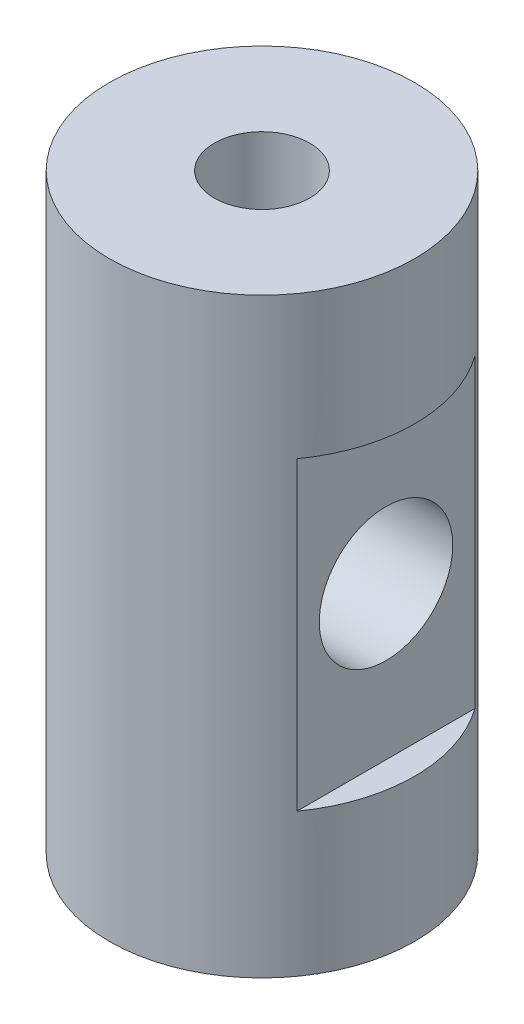
ISO-10303-21;
HEADER;
FILE_DESCRIPTION(('STEP AP214'),'2;1');
FILE_NAME('part.step','',(''),(''),'','','');
FILE_SCHEMA(('AUTOMOTIVE_DESIGN { 1 0 10303 214 1 1 1 1 }'));
ENDSEC;
DATA;
#1=APPLICATION_CONTEXT('core data for automotive mechanical design processes');
#2=APPLICATION_PROTOCOL_DEFINITION('international standard','automotive_design',2000,#1);
#3=PRODUCT_CONTEXT('',#1,'mechanical');
#4=PRODUCT('Part','Part','',(#3));
#5=PRODUCT_RELATED_PRODUCT_CATEGORY('part','',(#4));
#6=PRODUCT_DEFINITION_FORMATION('','',#4);
#7=PRODUCT_DEFINITION_CONTEXT('part definition',#1,'design');
#8=PRODUCT_DEFINITION('design','',#6,#7);
#9=PRODUCT_DEFINITION_SHAPE('','',#8);
#10=(LENGTH_UNIT() NAMED_UNIT(*) SI_UNIT(.MILLI.,.METRE.));
#11=(NAMED_UNIT(*) PLANE_ANGLE_UNIT() SI_UNIT($,.RADIAN.));
#12=(NAMED_UNIT(*) SI_UNIT($,.STERADIAN.) SOLID_ANGLE_UNIT());
#13=UNCERTAINTY_MEASURE_WITH_UNIT(LENGTH_MEASURE(1.E-05),#10,'distance_accuracy_value','');
#14=(GEOMETRIC_REPRESENTATION_CONTEXT(3) GLOBAL_UNCERTAINTY_ASSIGNED_CONTEXT((#13)) GLOBAL_UNIT_ASSIGNED_CONTEXT((#10,
#11,#12)) REPRESENTATION_CONTEXT('',''));
#15=CARTESIAN_POINT('',(0.,0.,0.));
#16=DIRECTION('',(0.,0.,1.));
#17=DIRECTION('',(1.,0.,0.));
#18=AXIS2_PLACEMENT_3D('',#15,#16,#17);
#19=CARTESIAN_POINT('',(0.,31.,0.));
#20=DIRECTION('',(0.,-1.,0.));
#21=DIRECTION('',(0.,0.,-1.));
#22=AXIS2_PLACEMENT_3D('',#19,#20,#21);
#23=CYLINDRICAL_SURFACE('',#22,8.);
#24=CARTESIAN_POINT('',(0.,7.5,0.));
#25=DIRECTION('',(0.,1.,0.));
#26=DIRECTION('',(-1.,0.,0.));
#27=AXIS2_PLACEMENT_3D('',#24,#25,#26);
#28=CIRCLE('',#27,8.);
#29=CARTESIAN_POINT('',(-6.5,7.5,-4.6636895265444));
#30=VERTEX_POINT('',#29);
#31=CARTESIAN_POINT('',(-6.5,7.5,4.6636895265444));
#32=VERTEX_POINT('',#31);
#33=EDGE_CURVE('E89',#30,#32,#28,.T.);
#34=ORIENTED_EDGE('',*,*,#33,.F.);
#35=DIRECTION('',(0.,-1.,0.));
#36=VECTOR('',#35,1.);
#37=CARTESIAN_POINT('',(-6.5,31.,-4.6636895265444));
#38=LINE('',#37,#36);
#39=CARTESIAN_POINT('',(-6.5,23.5,-4.6636895265444));
#40=VERTEX_POINT('',#39);
#41=EDGE_CURVE('E91',#40,#30,#38,.T.);
#42=ORIENTED_EDGE('',*,*,#41,.F.);
#43=CARTESIAN_POINT('',(0.,23.5,0.));
#44=DIRECTION('',(0.,-1.,0.));
#45=DIRECTION('',(0.,0.,-1.));
#46=AXIS2_PLACEMENT_3D('',#43,#44,#45);
#47=CIRCLE('',#46,8.);
#48=CARTESIAN_POINT('',(-6.5,23.5,4.6636895265444));
#49=VERTEX_POINT('',#48);
#50=EDGE_CURVE('E94',#49,#40,#47,.T.);
#51=ORIENTED_EDGE('',*,*,#50,.F.);
#52=DIRECTION('',(0.,-1.,0.));
#53=VECTOR('',#52,1.);
#54=CARTESIAN_POINT('',(-6.5,31.,4.6636895265444));
#55=LINE('',#54,#53);
#56=EDGE_CURVE('E92',#32,#49,#55,.F.);
#57=ORIENTED_EDGE('',*,*,#56,.F.);
#58=EDGE_LOOP('',(#34,#42,#51,#57));
#59=FACE_BOUND('',#58,.T.);
#60=CARTESIAN_POINT('',(0.,0.,0.));
#61=DIRECTION('',(0.,1.,0.));
#62=DIRECTION('',(0.,0.,1.));
#63=AXIS2_PLACEMENT_3D('',#60,#61,#62);
#64=CIRCLE('',#63,8.);
#65=CARTESIAN_POINT('',(0.,0.,8.));
#66=VERTEX_POINT('',#65);
#67=EDGE_CURVE('E126',#66,#66,#64,.T.);
#68=ORIENTED_EDGE('',*,*,#67,.T.);
#69=EDGE_LOOP('',(#68));
#70=FACE_BOUND('',#69,.T.);
#71=CARTESIAN_POINT('',(0.,31.,0.));
#72=DIRECTION('',(0.,1.,0.));
#73=DIRECTION('',(0.,0.,1.));
#74=AXIS2_PLACEMENT_3D('',#71,#72,#73);
#75=CIRCLE('',#74,8.);
#76=CARTESIAN_POINT('',(0.,31.,8.));
#77=VERTEX_POINT('',#76);
#78=EDGE_CURVE('E127',#77,#77,#75,.T.);
#79=ORIENTED_EDGE('',*,*,#78,.F.);
#80=EDGE_LOOP('',(#79));
#81=FACE_BOUND('',#80,.T.);
#82=CARTESIAN_POINT('',(0.,23.5,0.));
#83=DIRECTION('',(0.,-1.,0.));
#84=DIRECTION('',(0.,0.,-1.));
#85=AXIS2_PLACEMENT_3D('',#82,#83,#84);
#86=CIRCLE('',#85,8.);
#87=CARTESIAN_POINT('',(6.5,23.5,-4.6636895265444));
#88=VERTEX_POINT('',#87);
#89=CARTESIAN_POINT('',(6.5,23.5,4.6636895265444));
#90=VERTEX_POINT('',#89);
#91=EDGE_CURVE('E11',#88,#90,#86,.T.);
#92=ORIENTED_EDGE('',*,*,#91,.F.);
#93=DIRECTION('',(0.,-1.,0.));
#94=VECTOR('',#93,1.);
#95=CARTESIAN_POINT('',(6.5,31.,-4.6636895265444));
#96=LINE('',#95,#94);
#97=CARTESIAN_POINT('',(6.5,7.5,-4.66368952654441));
#98=VERTEX_POINT('',#97);
#99=EDGE_CURVE('E135',#98,#88,#96,.F.);
#100=ORIENTED_EDGE('',*,*,#99,.F.);
#101=CARTESIAN_POINT('',(0.,7.5,0.));
#102=DIRECTION('',(0.,1.,0.));
#103=DIRECTION('',(-1.,0.,0.));
#104=AXIS2_PLACEMENT_3D('',#101,#102,#103);
#105=CIRCLE('',#104,8.);
#106=CARTESIAN_POINT('',(6.5,7.5,4.66368952654441));
#107=VERTEX_POINT('',#106);
#108=EDGE_CURVE('E100',#107,#98,#105,.T.);
#109=ORIENTED_EDGE('',*,*,#108,.F.);
#110=DIRECTION('',(0.,-1.,0.));
#111=VECTOR('',#110,1.);
#112=CARTESIAN_POINT('',(6.5,31.,4.6636895265444));
#113=LINE('',#112,#111);
#114=EDGE_CURVE('E52',#90,#107,#113,.T.);
#115=ORIENTED_EDGE('',*,*,#114,.F.);
#116=EDGE_LOOP('',(#92,#100,#109,#115));
#117=FACE_BOUND('',#116,.T.);
#118=ADVANCED_FACE('F45',(#59,#70,#81,#117),#23,.T.);
#119=CARTESIAN_POINT('',(0.,0.,0.));
#120=DIRECTION('',(0.,1.,0.));
#121=DIRECTION('',(0.,0.,1.));
#122=AXIS2_PLACEMENT_3D('',#119,#120,#121);
#123=PLANE('',#122);
#124=ORIENTED_EDGE('',*,*,#67,.F.);
#125=EDGE_LOOP('',(#124));
#126=FACE_BOUND('',#125,.T.);
#127=CARTESIAN_POINT('',(0.,0.,0.));
#128=DIRECTION('',(0.,-1.,0.));
#129=DIRECTION('',(0.,0.,-1.));
#130=AXIS2_PLACEMENT_3D('',#127,#128,#129);
#131=CIRCLE('',#130,2.5);
#132=CARTESIAN_POINT('',(0.,0.,-2.5));
#133=VERTEX_POINT('',#132);
#134=EDGE_CURVE('E114',#133,#133,#131,.T.);
#135=ORIENTED_EDGE('',*,*,#134,.F.);
#136=EDGE_LOOP('',(#135));
#137=FACE_BOUND('',#136,.T.);
#138=ADVANCED_FACE('F168',(#126,#137),#123,.F.);
#139=CARTESIAN_POINT('',(0.,31.,0.));
#140=DIRECTION('',(0.,1.,0.));
#141=DIRECTION('',(0.,0.,1.));
#142=AXIS2_PLACEMENT_3D('',#139,#140,#141);
#143=PLANE('',#142);
#144=CARTESIAN_POINT('',(0.,31.,0.));
#145=DIRECTION('',(0.,1.,0.));
#146=DIRECTION('',(0.,0.,1.));
#147=AXIS2_PLACEMENT_3D('',#144,#145,#146);
#148=CIRCLE('',#147,2.5);
#149=CARTESIAN_POINT('',(0.,31.,2.5));
#150=VERTEX_POINT('',#149);
#151=EDGE_CURVE('E120',#150,#150,#148,.T.);
#152=ORIENTED_EDGE('',*,*,#151,.F.);
#153=EDGE_LOOP('',(#152));
#154=FACE_BOUND('',#153,.T.);
#155=ORIENTED_EDGE('',*,*,#78,.T.);
#156=EDGE_LOOP('',(#155));
#157=FACE_BOUND('',#156,.T.);
#158=ADVANCED_FACE('F174',(#154,#157),#143,.T.);
#159=CARTESIAN_POINT('',(0.,25.,0.));
#160=DIRECTION('',(0.,1.,0.));
#161=DIRECTION('',(0.,0.,1.));
#162=AXIS2_PLACEMENT_3D('',#159,#160,#161);
#163=CONICAL_SURFACE('',#162,2.5,1.02974425867665);
#164=CARTESIAN_POINT('',(0.,23.4978484524311,0.));
#165=VERTEX_POINT('',#164);
#166=VERTEX_LOOP('',#165);
#167=FACE_BOUND('',#166,.T.);
#168=CARTESIAN_POINT('',(0.,25.,0.));
#169=DIRECTION('',(0.,1.,0.));
#170=DIRECTION('',(0.,0.,1.));
#171=AXIS2_PLACEMENT_3D('',#168,#169,#170);
#172=CIRCLE('',#171,2.5);
#173=CARTESIAN_POINT('',(0.,25.,2.5));
#174=VERTEX_POINT('',#173);
#175=EDGE_CURVE('E123',#174,#174,#172,.T.);
#176=ORIENTED_EDGE('',*,*,#175,.T.);
#177=EDGE_LOOP('',(#176));
#178=FACE_BOUND('',#177,.T.);
#179=ADVANCED_FACE('F181',(#167,#178),#163,.F.);
#180=CARTESIAN_POINT('',(0.,31.,0.));
#181=DIRECTION('',(0.,1.,0.));
#182=DIRECTION('',(0.,0.,1.));
#183=AXIS2_PLACEMENT_3D('',#180,#181,#182);
#184=CYLINDRICAL_SURFACE('',#183,2.5);
#185=ORIENTED_EDGE('',*,*,#175,.F.);
#186=EDGE_LOOP('',(#185));
#187=FACE_BOUND('',#186,.T.);
#188=ORIENTED_EDGE('',*,*,#151,.T.);
#189=EDGE_LOOP('',(#188));
#190=FACE_BOUND('',#189,.T.);
#191=ADVANCED_FACE('F189',(#187,#190),#184,.F.);
#192=CARTESIAN_POINT('',(0.,6.,0.));
#193=DIRECTION('',(0.,-1.,0.));
#194=DIRECTION('',(0.,0.,-1.));
#195=AXIS2_PLACEMENT_3D('',#192,#193,#194);
#196=CONICAL_SURFACE('',#195,2.5,1.02974425867665);
#197=CARTESIAN_POINT('',(0.,7.5021515475689,0.));
#198=VERTEX_POINT('',#197);
#199=VERTEX_LOOP('',#198);
#200=FACE_BOUND('',#199,.T.);
#201=CARTESIAN_POINT('',(0.,6.,0.));
#202=DIRECTION('',(0.,-1.,0.));
#203=DIRECTION('',(0.,0.,-1.));
#204=AXIS2_PLACEMENT_3D('',#201,#202,#203);
#205=CIRCLE('',#204,2.5);
#206=CARTESIAN_POINT('',(0.,6.,-2.5));
#207=VERTEX_POINT('',#206);
#208=EDGE_CURVE('E117',#207,#207,#205,.T.);
#209=ORIENTED_EDGE('',*,*,#208,.T.);
#210=EDGE_LOOP('',(#209));
#211=FACE_BOUND('',#210,.T.);
#212=ADVANCED_FACE('F192',(#200,#211),#196,.F.);
#213=CARTESIAN_POINT('',(0.,0.,0.));
#214=DIRECTION('',(0.,-1.,0.));
#215=DIRECTION('',(0.,0.,-1.));
#216=AXIS2_PLACEMENT_3D('',#213,#214,#215);
#217=CYLINDRICAL_SURFACE('',#216,2.5);
#218=ORIENTED_EDGE('',*,*,#208,.F.);
#219=EDGE_LOOP('',(#218));
#220=FACE_BOUND('',#219,.T.);
#221=ORIENTED_EDGE('',*,*,#134,.T.);
#222=EDGE_LOOP('',(#221));
#223=FACE_BOUND('',#222,.T.);
#224=ADVANCED_FACE('F195',(#220,#223),#217,.F.);
#225=CARTESIAN_POINT('',(-6.5,23.5,10.));
#226=DIRECTION('',(0.,-1.,0.));
#227=DIRECTION('',(0.,0.,-1.));
#228=AXIS2_PLACEMENT_3D('',#225,#226,#227);
#229=PLANE('',#228);
#230=DIRECTION('',(0.,0.,-1.));
#231=VECTOR('',#230,1.);
#232=CARTESIAN_POINT('',(-6.5,23.5,10.));
#233=LINE('',#232,#231);
#234=EDGE_CURVE('E99',#49,#40,#233,.T.);
#235=ORIENTED_EDGE('',*,*,#234,.F.);
#236=ORIENTED_EDGE('',*,*,#50,.T.);
#237=EDGE_LOOP('',(#235,#236));
#238=FACE_BOUND('',#237,.T.);
#239=ADVANCED_FACE('F199',(#238),#229,.T.);
#240=CARTESIAN_POINT('',(-8.,7.5,10.));
#241=DIRECTION('',(0.,1.,0.));
#242=DIRECTION('',(-1.,0.,0.));
#243=AXIS2_PLACEMENT_3D('',#240,#241,#242);
#244=PLANE('',#243);
#245=ORIENTED_EDGE('',*,*,#33,.T.);
#246=DIRECTION('',(0.,0.,-1.));
#247=VECTOR('',#246,1.);
#248=CARTESIAN_POINT('',(-6.5,7.5,10.));
#249=LINE('',#248,#247);
#250=EDGE_CURVE('E59',#32,#30,#249,.T.);
#251=ORIENTED_EDGE('',*,*,#250,.T.);
#252=EDGE_LOOP('',(#245,#251));
#253=FACE_BOUND('',#252,.T.);
#254=ADVANCED_FACE('F102',(#253),#244,.T.);
#255=CARTESIAN_POINT('',(-6.5,7.5,10.));
#256=DIRECTION('',(-1.,0.,0.));
#257=DIRECTION('',(0.,-1.,0.));
#258=AXIS2_PLACEMENT_3D('',#255,#256,#257);
#259=PLANE('',#258);
#260=CARTESIAN_POINT('',(-6.5,15.5,0.));
#261=DIRECTION('',(-1.,0.,0.));
#262=DIRECTION('',(0.,-1.,0.));
#263=AXIS2_PLACEMENT_3D('',#260,#261,#262);
#264=CIRCLE('',#263,3.49999999999999);
#265=CARTESIAN_POINT('',(-6.5,12.,0.));
#266=VERTEX_POINT('',#265);
#267=EDGE_CURVE('E103',#266,#266,#264,.T.);
#268=ORIENTED_EDGE('',*,*,#267,.F.);
#269=EDGE_LOOP('',(#268));
#270=FACE_BOUND('',#269,.T.);
#271=ORIENTED_EDGE('',*,*,#41,.T.);
#272=ORIENTED_EDGE('',*,*,#250,.F.);
#273=ORIENTED_EDGE('',*,*,#56,.T.);
#274=ORIENTED_EDGE('',*,*,#234,.T.);
#275=EDGE_LOOP('',(#271,#272,#273,#274));
#276=FACE_BOUND('',#275,.T.);
#277=ADVANCED_FACE('F97',(#270,#276),#259,.T.);
#278=CARTESIAN_POINT('',(6.5,23.5,10.));
#279=DIRECTION('',(0.,-1.,0.));
#280=DIRECTION('',(0.,0.,-1.));
#281=AXIS2_PLACEMENT_3D('',#278,#279,#280);
#282=PLANE('',#281);
#283=DIRECTION('',(0.,0.,-1.));
#284=VECTOR('',#283,1.);
#285=CARTESIAN_POINT('',(6.5,23.5,10.));
#286=LINE('',#285,#284);
#287=EDGE_CURVE('E111',#90,#88,#286,.T.);
#288=ORIENTED_EDGE('',*,*,#287,.T.);
#289=ORIENTED_EDGE('',*,*,#91,.T.);
#290=EDGE_LOOP('',(#288,#289));
#291=FACE_BOUND('',#290,.T.);
#292=ADVANCED_FACE('F156',(#291),#282,.T.);
#293=CARTESIAN_POINT('',(6.5,7.5,10.));
#294=DIRECTION('',(1.,0.,0.));
#295=DIRECTION('',(0.,1.,0.));
#296=AXIS2_PLACEMENT_3D('',#293,#294,#295);
#297=PLANE('',#296);
#298=CARTESIAN_POINT('',(6.5,15.5,0.));
#299=DIRECTION('',(1.,0.,0.));
#300=DIRECTION('',(0.,0.,-1.));
#301=AXIS2_PLACEMENT_3D('',#298,#299,#300);
#302=CIRCLE('',#301,3.49999999999999);
#303=CARTESIAN_POINT('',(6.5,15.5,-3.49999999999999));
#304=VERTEX_POINT('',#303);
#305=EDGE_CURVE('E108',#304,#304,#302,.T.);
#306=ORIENTED_EDGE('',*,*,#305,.F.);
#307=EDGE_LOOP('',(#306));
#308=FACE_BOUND('',#307,.T.);
#309=ORIENTED_EDGE('',*,*,#114,.T.);
#310=DIRECTION('',(0.,0.,-1.));
#311=VECTOR('',#310,1.);
#312=CARTESIAN_POINT('',(6.5,7.5,10.));
#313=LINE('',#312,#311);
#314=EDGE_CURVE('E105',#107,#98,#313,.T.);
#315=ORIENTED_EDGE('',*,*,#314,.T.);
#316=ORIENTED_EDGE('',*,*,#99,.T.);
#317=ORIENTED_EDGE('',*,*,#287,.F.);
#318=EDGE_LOOP('',(#309,#315,#316,#317));
#319=FACE_BOUND('',#318,.T.);
#320=ADVANCED_FACE('F143',(#308,#319),#297,.T.);
#321=CARTESIAN_POINT('',(8.,7.5,10.));
#322=DIRECTION('',(0.,1.,0.));
#323=DIRECTION('',(-1.,0.,0.));
#324=AXIS2_PLACEMENT_3D('',#321,#322,#323);
#325=PLANE('',#324);
#326=ORIENTED_EDGE('',*,*,#314,.F.);
#327=ORIENTED_EDGE('',*,*,#108,.T.);
#328=EDGE_LOOP('',(#326,#327));
#329=FACE_BOUND('',#328,.T.);
#330=ADVANCED_FACE('F148',(#329),#325,.T.);
#331=CARTESIAN_POINT('',(6.5,15.5,0.));
#332=DIRECTION('',(1.,0.,0.));
#333=DIRECTION('',(0.,0.,-1.));
#334=AXIS2_PLACEMENT_3D('',#331,#332,#333);
#335=CYLINDRICAL_SURFACE('',#334,3.49999999999999);
#336=ORIENTED_EDGE('',*,*,#267,.T.);
#337=EDGE_LOOP('',(#336));
#338=FACE_BOUND('',#337,.T.);
#339=ORIENTED_EDGE('',*,*,#305,.T.);
#340=EDGE_LOOP('',(#339));
#341=FACE_BOUND('',#340,.T.);
#342=ADVANCED_FACE('F153',(#338,#341),#335,.F.);
#343=CLOSED_SHELL('',(#118,#138,#158,#179,#191,#212,#224,#239,#254,#277,#292,#320,#330,#342));
#344=MANIFOLD_SOLID_BREP('B2',#343);
#345=ADVANCED_BREP_SHAPE_REPRESENTATION('',(#18,#344),#14);
#346=SHAPE_DEFINITION_REPRESENTATION(#9,#345);
ENDSEC;
END-ISO-10303-21;
